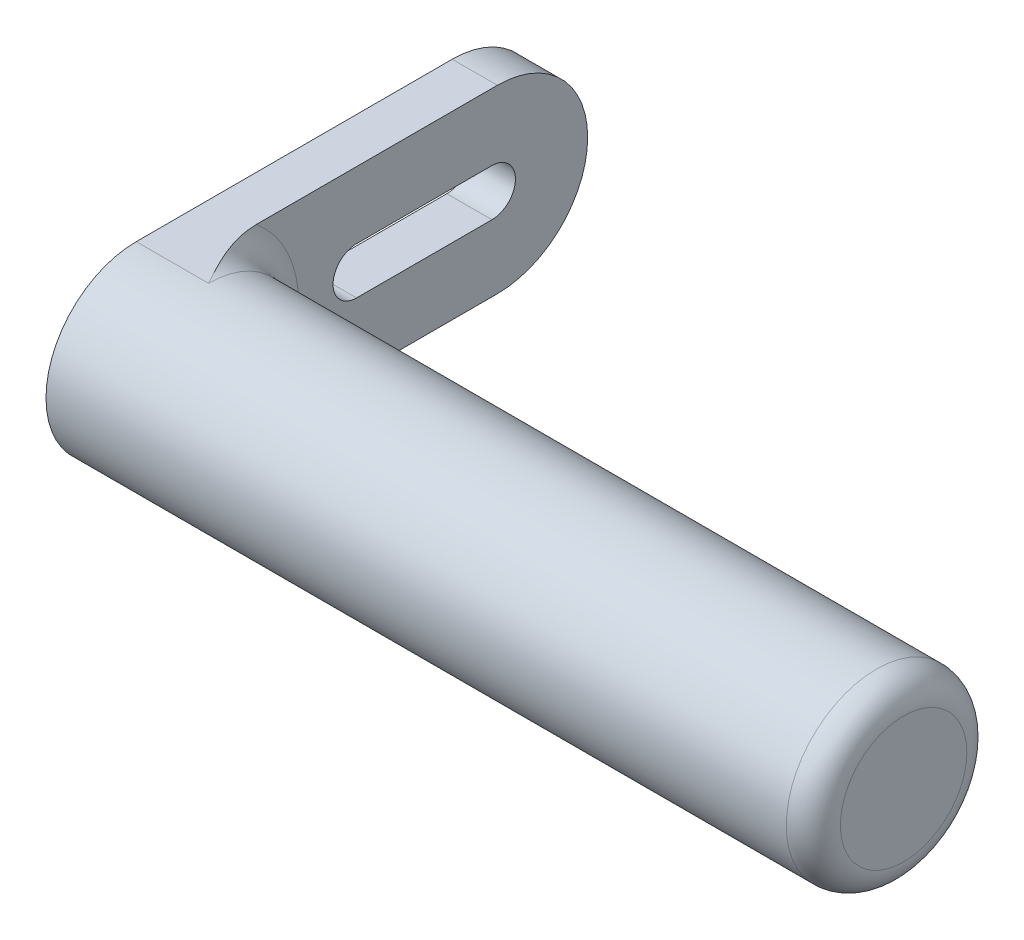
ISO-10303-21;
HEADER;
FILE_DESCRIPTION(('STEP AP214'),'2;1');
FILE_NAME('part.step','',(''),(''),'','','');
FILE_SCHEMA(('AUTOMOTIVE_DESIGN { 1 0 10303 214 1 1 1 1 }'));
ENDSEC;
DATA;
#1=APPLICATION_CONTEXT('core data for automotive mechanical design processes');
#2=APPLICATION_PROTOCOL_DEFINITION('international standard','automotive_design',2000,#1);
#3=PRODUCT_CONTEXT('',#1,'mechanical');
#4=PRODUCT('Part','Part','',(#3));
#5=PRODUCT_RELATED_PRODUCT_CATEGORY('part','',(#4));
#6=PRODUCT_DEFINITION_FORMATION('','',#4);
#7=PRODUCT_DEFINITION_CONTEXT('part definition',#1,'design');
#8=PRODUCT_DEFINITION('design','',#6,#7);
#9=PRODUCT_DEFINITION_SHAPE('','',#8);
#10=(LENGTH_UNIT() NAMED_UNIT(*) SI_UNIT(.MILLI.,.METRE.));
#11=(NAMED_UNIT(*) PLANE_ANGLE_UNIT() SI_UNIT($,.RADIAN.));
#12=(NAMED_UNIT(*) SI_UNIT($,.STERADIAN.) SOLID_ANGLE_UNIT());
#13=UNCERTAINTY_MEASURE_WITH_UNIT(LENGTH_MEASURE(1.E-05),#10,'distance_accuracy_value','');
#14=(GEOMETRIC_REPRESENTATION_CONTEXT(3) GLOBAL_UNCERTAINTY_ASSIGNED_CONTEXT((#13)) GLOBAL_UNIT_ASSIGNED_CONTEXT((#10,
#11,#12)) REPRESENTATION_CONTEXT('',''));
#15=CARTESIAN_POINT('',(0.,0.,0.));
#16=DIRECTION('',(0.,0.,1.));
#17=DIRECTION('',(1.,0.,0.));
#18=AXIS2_PLACEMENT_3D('',#15,#16,#17);
#19=CARTESIAN_POINT('',(5.,-10.,-27.5));
#20=DIRECTION('',(0.,1.,0.));
#21=DIRECTION('',(0.,0.,1.));
#22=AXIS2_PLACEMENT_3D('',#19,#20,#21);
#23=PLANE('',#22);
#24=DIRECTION('',(0.,0.,-1.));
#25=VECTOR('',#24,1.);
#26=CARTESIAN_POINT('',(0.,-10.,-27.5));
#27=LINE('',#26,#25);
#28=CARTESIAN_POINT('',(0.,-10.,17.5));
#29=VERTEX_POINT('',#28);
#30=CARTESIAN_POINT('',(0.,-10.,-17.5));
#31=VERTEX_POINT('',#30);
#32=EDGE_CURVE('E166',#29,#31,#27,.T.);
#33=ORIENTED_EDGE('',*,*,#32,.T.);
#34=DIRECTION('',(-1.,0.,0.));
#35=VECTOR('',#34,1.);
#36=CARTESIAN_POINT('',(5.,-10.,-17.5));
#37=LINE('',#36,#35);
#38=CARTESIAN_POINT('',(5.,-10.,-17.5));
#39=VERTEX_POINT('',#38);
#40=EDGE_CURVE('E182',#31,#39,#37,.F.);
#41=ORIENTED_EDGE('',*,*,#40,.T.);
#42=DIRECTION('',(0.,0.,-1.));
#43=VECTOR('',#42,1.);
#44=CARTESIAN_POINT('',(5.,-10.,-27.5));
#45=LINE('',#44,#43);
#46=CARTESIAN_POINT('',(5.,-10.,9.19337613708191));
#47=VERTEX_POINT('',#46);
#48=EDGE_CURVE('E160',#47,#39,#45,.T.);
#49=ORIENTED_EDGE('',*,*,#48,.F.);
#50=CARTESIAN_POINT('',(5.,-10.,9.19337613708191));
#51=CARTESIAN_POINT('',(5.00000510109143,-10.,9.31468516190168));
#52=CARTESIAN_POINT('',(5.00300345678224,-10.,9.43596185238606));
#53=CARTESIAN_POINT('',(5.01455369503832,-10.,9.67820887001465));
#54=CARTESIAN_POINT('',(5.02310352854649,-10.,9.79917929367025));
#55=CARTESIAN_POINT('',(5.05638491302613,-10.,10.1608609564875));
#56=CARTESIAN_POINT('',(5.08875229772567,-10.,10.4008889053362));
#57=CARTESIAN_POINT('',(5.17025826652768,-10.,10.8746661518443));
#58=CARTESIAN_POINT('',(5.21916642341927,-10.,11.1084564850378));
#59=CARTESIAN_POINT('',(5.3313246535228,-10.,11.5726822175656));
#60=CARTESIAN_POINT('',(5.39458332424151,-10.,11.8031155172388));
#61=CARTESIAN_POINT('',(5.53638839561794,-10.,12.2708661108335));
#62=CARTESIAN_POINT('',(5.61550693926716,-10.,12.5080082663547));
#63=CARTESIAN_POINT('',(5.78473378693082,-10.,12.9783635528256));
#64=CARTESIAN_POINT('',(5.87484471194332,-10.,13.2115757315748));
#65=CARTESIAN_POINT('',(6.15872613427247,-10.,13.9059414934295));
#66=CARTESIAN_POINT('',(6.36596341359942,-10.,14.3615693550655));
#67=CARTESIAN_POINT('',(6.8038510541255,-10.,15.2643439869068));
#68=CARTESIAN_POINT('',(7.0346299439147,-10.,15.7114264331831));
#69=CARTESIAN_POINT('',(7.50704928301317,-10.,16.5998419692275));
#70=CARTESIAN_POINT('',(7.74869175724695,-10.,17.041173967198));
#71=CARTESIAN_POINT('',(7.99359487601124,-10.,17.4883058946273));
#72=CARTESIAN_POINT('',(7.99679743913195,-10.,17.4941529481126));
#73=CARTESIAN_POINT('',(8.,-10.,17.5));
#74=B_SPLINE_CURVE_WITH_KNOTS('',3,(#50,#51,#52,#53,#54,#55,#56,#57,#58,#59,#60,#61,#62,#63,#64,
#65,#66,#67,#68,#69,#70,#71,#72,#73),.UNSPECIFIED.,.F.,.F.,(4,2,2,2,2,2,2,2,2,2,2,4),(0.,
0.363837513676666,0.72754081077388,1.45331414152031,2.16936699582229,2.88584998135366,
3.63550066459568,4.3853304434829,5.88579076071039,7.39493262321677,8.90435695897777,
8.92435695897769),.UNSPECIFIED.);
#75=CARTESIAN_POINT('',(8.,-10.,17.5));
#76=VERTEX_POINT('',#75);
#77=EDGE_CURVE('E207',#47,#76,#74,.T.);
#78=ORIENTED_EDGE('',*,*,#77,.T.);
#79=DIRECTION('',(-1.,0.,0.));
#80=VECTOR('',#79,1.);
#81=CARTESIAN_POINT('',(5.,-10.,17.5));
#82=LINE('',#81,#80);
#83=EDGE_CURVE('E179',#76,#29,#82,.T.);
#84=ORIENTED_EDGE('',*,*,#83,.T.);
#85=EDGE_LOOP('',(#33,#41,#49,#78,#84));
#86=FACE_BOUND('',#85,.T.);
#87=ADVANCED_FACE('F32',(#86),#23,.F.);
#88=CARTESIAN_POINT('',(5.,10.,-27.5));
#89=DIRECTION('',(0.,-1.,0.));
#90=DIRECTION('',(0.,0.,-1.));
#91=AXIS2_PLACEMENT_3D('',#88,#89,#90);
#92=PLANE('',#91);
#93=DIRECTION('',(0.,0.,1.));
#94=VECTOR('',#93,1.);
#95=CARTESIAN_POINT('',(5.,10.,-27.5));
#96=LINE('',#95,#94);
#97=CARTESIAN_POINT('',(5.,10.,-17.5));
#98=VERTEX_POINT('',#97);
#99=CARTESIAN_POINT('',(5.,10.,9.19337613708191));
#100=VERTEX_POINT('',#99);
#101=EDGE_CURVE('E162',#98,#100,#96,.T.);
#102=ORIENTED_EDGE('',*,*,#101,.F.);
#103=DIRECTION('',(-1.,0.,0.));
#104=VECTOR('',#103,1.);
#105=CARTESIAN_POINT('',(5.,10.,-17.5));
#106=LINE('',#105,#104);
#107=CARTESIAN_POINT('',(0.,10.,-17.5));
#108=VERTEX_POINT('',#107);
#109=EDGE_CURVE('E191',#98,#108,#106,.T.);
#110=ORIENTED_EDGE('',*,*,#109,.T.);
#111=DIRECTION('',(0.,0.,1.));
#112=VECTOR('',#111,1.);
#113=CARTESIAN_POINT('',(0.,10.,-27.5));
#114=LINE('',#113,#112);
#115=CARTESIAN_POINT('',(0.,10.,17.5));
#116=VERTEX_POINT('',#115);
#117=EDGE_CURVE('E163',#108,#116,#114,.T.);
#118=ORIENTED_EDGE('',*,*,#117,.T.);
#119=DIRECTION('',(-1.,0.,0.));
#120=VECTOR('',#119,1.);
#121=CARTESIAN_POINT('',(5.,10.,17.5));
#122=LINE('',#121,#120);
#123=CARTESIAN_POINT('',(8.,10.,17.5));
#124=VERTEX_POINT('',#123);
#125=EDGE_CURVE('E189',#116,#124,#122,.F.);
#126=ORIENTED_EDGE('',*,*,#125,.T.);
#127=CARTESIAN_POINT('',(5.,10.,9.19337613708191));
#128=CARTESIAN_POINT('',(5.00000510109143,10.,9.3146851619019));
#129=CARTESIAN_POINT('',(5.00300345678225,10.,9.43596185238649));
#130=CARTESIAN_POINT('',(5.01455369503837,10.,9.6782088700155));
#131=CARTESIAN_POINT('',(5.02310352854657,10.,9.79917929367132));
#132=CARTESIAN_POINT('',(5.05638491302631,10.,10.1608609564891));
#133=CARTESIAN_POINT('',(5.08875229772595,10.,10.4008889053381));
#134=CARTESIAN_POINT('',(5.17025826652805,10.,10.8746661518461));
#135=CARTESIAN_POINT('',(5.21916642341959,10.,11.1084564850392));
#136=CARTESIAN_POINT('',(5.33132465352298,10.,11.5726822175662));
#137=CARTESIAN_POINT('',(5.39458332424161,10.,11.8031155172391));
#138=CARTESIAN_POINT('',(5.53638839561793,10.,12.2708661108334));
#139=CARTESIAN_POINT('',(5.61550693926714,10.,12.5080082663546));
#140=CARTESIAN_POINT('',(5.78473378693072,10.,12.9783635528254));
#141=CARTESIAN_POINT('',(5.87484471194315,10.,13.2115757315746));
#142=CARTESIAN_POINT('',(6.15872613427236,10.,13.9059414934289));
#143=CARTESIAN_POINT('',(6.36596341359978,10.,14.3615693550642));
#144=CARTESIAN_POINT('',(6.80385105412424,10.,15.2643439869062));
#145=CARTESIAN_POINT('',(7.03462994391135,10.,15.7114264331839));
#146=CARTESIAN_POINT('',(7.50704928301584,10.,16.5998419692255));
#147=CARTESIAN_POINT('',(7.74869175725775,10.,17.0411739671918));
#148=CARTESIAN_POINT('',(7.99359487601154,10.,17.4883058946272));
#149=CARTESIAN_POINT('',(7.9967974391321,10.,17.4941529481126));
#150=CARTESIAN_POINT('',(8.,10.,17.5));
#151=B_SPLINE_CURVE_WITH_KNOTS('',3,(#127,#128,#129,#130,#131,#132,#133,#134,#135,#136,#137,
#138,#139,#140,#141,#142,#143,#144,#145,#146,#147,#148,#149,#150),.UNSPECIFIED.,.F.,.F.,(4,2,2,
2,2,2,2,2,2,2,2,4),(0.,0.363837513677303,0.727540810775156,1.45331414152258,2.16936699582333,
2.88584998135365,3.63550066459548,4.38533044348258,5.88579076070911,7.39493262321602,
8.9043569589778,8.92435695897769),.UNSPECIFIED.);
#152=EDGE_CURVE('E47',#124,#100,#151,.F.);
#153=ORIENTED_EDGE('',*,*,#152,.T.);
#154=EDGE_LOOP('',(#102,#110,#118,#126,#153));
#155=FACE_BOUND('',#154,.T.);
#156=ADVANCED_FACE('F216',(#155),#92,.F.);
#157=CARTESIAN_POINT('',(5.,0.,0.));
#158=DIRECTION('',(1.,0.,0.));
#159=DIRECTION('',(0.,0.,-1.));
#160=AXIS2_PLACEMENT_3D('',#157,#158,#159);
#161=PLANE('',#160);
#162=ORIENTED_EDGE('',*,*,#101,.T.);
#163=CARTESIAN_POINT('',(5.,0.,17.5));
#164=DIRECTION('',(1.,0.,0.));
#165=DIRECTION('',(0.,0.,-1.));
#166=AXIS2_PLACEMENT_3D('',#163,#164,#165);
#167=CIRCLE('',#166,13.);
#168=EDGE_CURVE('E54',#100,#47,#167,.F.);
#169=ORIENTED_EDGE('',*,*,#168,.T.);
#170=ORIENTED_EDGE('',*,*,#48,.T.);
#171=CARTESIAN_POINT('',(5.,0.,-17.5));
#172=DIRECTION('',(1.,0.,0.));
#173=DIRECTION('',(0.,0.,-1.));
#174=AXIS2_PLACEMENT_3D('',#171,#172,#173);
#175=CIRCLE('',#174,10.);
#176=CARTESIAN_POINT('',(5.,0.,-27.5));
#177=VERTEX_POINT('',#176);
#178=EDGE_CURVE('E187',#39,#177,#175,.T.);
#179=ORIENTED_EDGE('',*,*,#178,.T.);
#180=CARTESIAN_POINT('',(5.,0.,-17.5));
#181=DIRECTION('',(1.,0.,0.));
#182=DIRECTION('',(0.,0.,-1.));
#183=AXIS2_PLACEMENT_3D('',#180,#181,#182);
#184=CIRCLE('',#183,10.);
#185=EDGE_CURVE('E185',#177,#98,#184,.T.);
#186=ORIENTED_EDGE('',*,*,#185,.T.);
#187=EDGE_LOOP('',(#162,#169,#170,#179,#186));
#188=FACE_BOUND('',#187,.T.);
#189=CARTESIAN_POINT('',(5.,0.,-16.9));
#190=DIRECTION('',(1.,0.,0.));
#191=DIRECTION('',(0.,0.,1.));
#192=AXIS2_PLACEMENT_3D('',#189,#190,#191);
#193=CIRCLE('',#192,2.60000000000001);
#194=CARTESIAN_POINT('',(5.,-2.60000000000001,-16.9));
#195=VERTEX_POINT('',#194);
#196=CARTESIAN_POINT('',(5.,2.60000000000001,-16.9));
#197=VERTEX_POINT('',#196);
#198=EDGE_CURVE('E123',#195,#197,#193,.T.);
#199=ORIENTED_EDGE('',*,*,#198,.F.);
#200=DIRECTION('',(0.,0.,-1.));
#201=VECTOR('',#200,1.);
#202=CARTESIAN_POINT('',(5.,-2.60000000000001,-16.9));
#203=LINE('',#202,#201);
#204=CARTESIAN_POINT('',(5.,-2.6,-1.90000000000001));
#205=VERTEX_POINT('',#204);
#206=EDGE_CURVE('E141',#205,#195,#203,.T.);
#207=ORIENTED_EDGE('',*,*,#206,.F.);
#208=CARTESIAN_POINT('',(5.,0.,-1.90000000000001));
#209=DIRECTION('',(1.,0.,0.));
#210=DIRECTION('',(0.,0.,-1.));
#211=AXIS2_PLACEMENT_3D('',#208,#209,#210);
#212=CIRCLE('',#211,2.6);
#213=CARTESIAN_POINT('',(5.,2.6,-1.90000000000001));
#214=VERTEX_POINT('',#213);
#215=EDGE_CURVE('E144',#214,#205,#212,.T.);
#216=ORIENTED_EDGE('',*,*,#215,.F.);
#217=DIRECTION('',(0.,0.,1.));
#218=VECTOR('',#217,1.);
#219=CARTESIAN_POINT('',(5.,2.60000000000001,-16.9));
#220=LINE('',#219,#218);
#221=EDGE_CURVE('E150',#197,#214,#220,.T.);
#222=ORIENTED_EDGE('',*,*,#221,.F.);
#223=EDGE_LOOP('',(#199,#207,#216,#222));
#224=FACE_BOUND('',#223,.T.);
#225=ADVANCED_FACE('F220',(#188,#224),#161,.T.);
#226=CARTESIAN_POINT('',(0.,0.,0.));
#227=DIRECTION('',(1.,0.,0.));
#228=DIRECTION('',(0.,0.,-1.));
#229=AXIS2_PLACEMENT_3D('',#226,#227,#228);
#230=PLANE('',#229);
#231=DIRECTION('',(0.,0.,-1.));
#232=VECTOR('',#231,1.);
#233=CARTESIAN_POINT('',(0.,-2.60000000000001,-16.9));
#234=LINE('',#233,#232);
#235=CARTESIAN_POINT('',(0.,-2.6,-1.90000000000001));
#236=VERTEX_POINT('',#235);
#237=CARTESIAN_POINT('',(0.,-2.60000000000001,-16.9));
#238=VERTEX_POINT('',#237);
#239=EDGE_CURVE('E128',#236,#238,#234,.T.);
#240=ORIENTED_EDGE('',*,*,#239,.T.);
#241=CARTESIAN_POINT('',(0.,0.,-16.9));
#242=DIRECTION('',(1.,0.,0.));
#243=DIRECTION('',(0.,0.,1.));
#244=AXIS2_PLACEMENT_3D('',#241,#242,#243);
#245=CIRCLE('',#244,2.60000000000001);
#246=CARTESIAN_POINT('',(0.,2.60000000000001,-16.9));
#247=VERTEX_POINT('',#246);
#248=EDGE_CURVE('E120',#238,#247,#245,.T.);
#249=ORIENTED_EDGE('',*,*,#248,.T.);
#250=DIRECTION('',(0.,0.,1.));
#251=VECTOR('',#250,1.);
#252=CARTESIAN_POINT('',(0.,2.60000000000001,-16.9));
#253=LINE('',#252,#251);
#254=CARTESIAN_POINT('',(0.,2.6,-1.90000000000001));
#255=VERTEX_POINT('',#254);
#256=EDGE_CURVE('E132',#247,#255,#253,.T.);
#257=ORIENTED_EDGE('',*,*,#256,.T.);
#258=CARTESIAN_POINT('',(0.,0.,-1.90000000000001));
#259=DIRECTION('',(1.,0.,0.));
#260=DIRECTION('',(0.,0.,-1.));
#261=AXIS2_PLACEMENT_3D('',#258,#259,#260);
#262=CIRCLE('',#261,2.6);
#263=EDGE_CURVE('E136',#255,#236,#262,.T.);
#264=ORIENTED_EDGE('',*,*,#263,.T.);
#265=EDGE_LOOP('',(#240,#249,#257,#264));
#266=FACE_BOUND('',#265,.T.);
#267=CARTESIAN_POINT('',(0.,0.,-17.5));
#268=DIRECTION('',(1.,0.,0.));
#269=DIRECTION('',(0.,0.,-1.));
#270=AXIS2_PLACEMENT_3D('',#267,#268,#269);
#271=CIRCLE('',#270,10.);
#272=CARTESIAN_POINT('',(0.,0.,-27.5));
#273=VERTEX_POINT('',#272);
#274=EDGE_CURVE('E175',#108,#273,#271,.F.);
#275=ORIENTED_EDGE('',*,*,#274,.T.);
#276=CARTESIAN_POINT('',(0.,0.,-17.5));
#277=DIRECTION('',(1.,0.,0.));
#278=DIRECTION('',(0.,0.,-1.));
#279=AXIS2_PLACEMENT_3D('',#276,#277,#278);
#280=CIRCLE('',#279,10.);
#281=EDGE_CURVE('E177',#273,#31,#280,.F.);
#282=ORIENTED_EDGE('',*,*,#281,.T.);
#283=ORIENTED_EDGE('',*,*,#32,.F.);
#284=CARTESIAN_POINT('',(0.,0.,17.5));
#285=DIRECTION('',(1.,0.,0.));
#286=DIRECTION('',(0.,0.,-1.));
#287=AXIS2_PLACEMENT_3D('',#284,#285,#286);
#288=CIRCLE('',#287,10.);
#289=CARTESIAN_POINT('',(0.,0.,27.5));
#290=VERTEX_POINT('',#289);
#291=EDGE_CURVE('E173',#29,#290,#288,.F.);
#292=ORIENTED_EDGE('',*,*,#291,.T.);
#293=CARTESIAN_POINT('',(0.,0.,17.5));
#294=DIRECTION('',(1.,0.,0.));
#295=DIRECTION('',(0.,0.,-1.));
#296=AXIS2_PLACEMENT_3D('',#293,#294,#295);
#297=CIRCLE('',#296,10.);
#298=EDGE_CURVE('E165',#290,#116,#297,.F.);
#299=ORIENTED_EDGE('',*,*,#298,.T.);
#300=ORIENTED_EDGE('',*,*,#117,.F.);
#301=EDGE_LOOP('',(#275,#282,#283,#292,#299,#300));
#302=FACE_BOUND('',#301,.T.);
#303=ADVANCED_FACE('F138',(#266,#302),#230,.F.);
#304=CARTESIAN_POINT('',(5.,0.,-17.5));
#305=DIRECTION('',(-1.,0.,0.));
#306=DIRECTION('',(0.,0.,1.));
#307=AXIS2_PLACEMENT_3D('',#304,#305,#306);
#308=CYLINDRICAL_SURFACE('',#307,10.);
#309=ORIENTED_EDGE('',*,*,#109,.F.);
#310=ORIENTED_EDGE('',*,*,#185,.F.);
#311=DIRECTION('',(-1.,0.,0.));
#312=VECTOR('',#311,1.);
#313=CARTESIAN_POINT('',(5.,0.,-27.5));
#314=LINE('',#313,#312);
#315=EDGE_CURVE('E169',#273,#177,#314,.F.);
#316=ORIENTED_EDGE('',*,*,#315,.F.);
#317=ORIENTED_EDGE('',*,*,#274,.F.);
#318=EDGE_LOOP('',(#309,#310,#316,#317));
#319=FACE_BOUND('',#318,.T.);
#320=ADVANCED_FACE('F230',(#319),#308,.T.);
#321=CARTESIAN_POINT('',(5.,0.,-17.5));
#322=DIRECTION('',(-1.,0.,0.));
#323=DIRECTION('',(0.,0.,1.));
#324=AXIS2_PLACEMENT_3D('',#321,#322,#323);
#325=CYLINDRICAL_SURFACE('',#324,10.);
#326=ORIENTED_EDGE('',*,*,#178,.F.);
#327=ORIENTED_EDGE('',*,*,#40,.F.);
#328=ORIENTED_EDGE('',*,*,#281,.F.);
#329=ORIENTED_EDGE('',*,*,#315,.T.);
#330=EDGE_LOOP('',(#326,#327,#328,#329));
#331=FACE_BOUND('',#330,.T.);
#332=ADVANCED_FACE('F226',(#331),#325,.T.);
#333=CARTESIAN_POINT('',(5.,0.,17.5));
#334=DIRECTION('',(-1.,0.,0.));
#335=DIRECTION('',(0.,0.,1.));
#336=AXIS2_PLACEMENT_3D('',#333,#334,#335);
#337=CYLINDRICAL_SURFACE('',#336,10.);
#338=CARTESIAN_POINT('',(82.,0.,17.5));
#339=DIRECTION('',(1.,0.,0.));
#340=DIRECTION('',(0.,0.,-1.));
#341=AXIS2_PLACEMENT_3D('',#338,#339,#340);
#342=CIRCLE('',#341,10.);
#343=CARTESIAN_POINT('',(82.,0.,7.49999999999999));
#344=VERTEX_POINT('',#343);
#345=EDGE_CURVE('E11',#344,#344,#342,.F.);
#346=ORIENTED_EDGE('',*,*,#345,.T.);
#347=EDGE_LOOP('',(#346));
#348=FACE_BOUND('',#347,.T.);
#349=CARTESIAN_POINT('',(8.,0.,17.5));
#350=DIRECTION('',(1.,0.,0.));
#351=DIRECTION('',(0.,0.,-1.));
#352=AXIS2_PLACEMENT_3D('',#349,#350,#351);
#353=CIRCLE('',#352,10.);
#354=EDGE_CURVE('E193',#76,#124,#353,.T.);
#355=ORIENTED_EDGE('',*,*,#354,.T.);
#356=ORIENTED_EDGE('',*,*,#125,.F.);
#357=ORIENTED_EDGE('',*,*,#298,.F.);
#358=DIRECTION('',(-1.,0.,0.));
#359=VECTOR('',#358,1.);
#360=CARTESIAN_POINT('',(5.,0.,27.5));
#361=LINE('',#360,#359);
#362=CARTESIAN_POINT('',(5.,0.,27.5));
#363=VERTEX_POINT('',#362);
#364=EDGE_CURVE('E156',#363,#290,#361,.T.);
#365=ORIENTED_EDGE('',*,*,#364,.F.);
#366=ORIENTED_EDGE('',*,*,#364,.T.);
#367=ORIENTED_EDGE('',*,*,#291,.F.);
#368=ORIENTED_EDGE('',*,*,#83,.F.);
#369=EDGE_LOOP('',(#355,#356,#357,#365,#366,#367,#368));
#370=FACE_BOUND('',#369,.T.);
#371=ADVANCED_FACE('F229',(#348,#370),#337,.T.);
#372=CARTESIAN_POINT('',(0.,0.,-16.9));
#373=DIRECTION('',(1.,0.,0.));
#374=DIRECTION('',(0.,0.,-1.));
#375=AXIS2_PLACEMENT_3D('',#372,#373,#374);
#376=CYLINDRICAL_SURFACE('',#375,2.60000000000001);
#377=ORIENTED_EDGE('',*,*,#198,.T.);
#378=DIRECTION('',(1.,0.,0.));
#379=VECTOR('',#378,1.);
#380=CARTESIAN_POINT('',(0.,2.60000000000001,-16.9));
#381=LINE('',#380,#379);
#382=EDGE_CURVE('E116',#247,#197,#381,.T.);
#383=ORIENTED_EDGE('',*,*,#382,.F.);
#384=ORIENTED_EDGE('',*,*,#248,.F.);
#385=DIRECTION('',(1.,0.,0.));
#386=VECTOR('',#385,1.);
#387=CARTESIAN_POINT('',(0.,-2.60000000000001,-16.9));
#388=LINE('',#387,#386);
#389=EDGE_CURVE('E154',#238,#195,#388,.T.);
#390=ORIENTED_EDGE('',*,*,#389,.T.);
#391=EDGE_LOOP('',(#377,#383,#384,#390));
#392=FACE_BOUND('',#391,.T.);
#393=ADVANCED_FACE('F118',(#392),#376,.F.);
#394=CARTESIAN_POINT('',(0.,-2.60000000000001,-16.9));
#395=DIRECTION('',(0.,-1.,0.));
#396=DIRECTION('',(0.,0.,-1.));
#397=AXIS2_PLACEMENT_3D('',#394,#395,#396);
#398=PLANE('',#397);
#399=ORIENTED_EDGE('',*,*,#206,.T.);
#400=ORIENTED_EDGE('',*,*,#389,.F.);
#401=ORIENTED_EDGE('',*,*,#239,.F.);
#402=DIRECTION('',(1.,0.,0.));
#403=VECTOR('',#402,1.);
#404=CARTESIAN_POINT('',(0.,-2.6,-1.90000000000001));
#405=LINE('',#404,#403);
#406=EDGE_CURVE('E157',#236,#205,#405,.T.);
#407=ORIENTED_EDGE('',*,*,#406,.T.);
#408=EDGE_LOOP('',(#399,#400,#401,#407));
#409=FACE_BOUND('',#408,.T.);
#410=ADVANCED_FACE('F239',(#409),#398,.F.);
#411=CARTESIAN_POINT('',(0.,0.,-1.90000000000001));
#412=DIRECTION('',(1.,0.,0.));
#413=DIRECTION('',(0.,0.,-1.));
#414=AXIS2_PLACEMENT_3D('',#411,#412,#413);
#415=CYLINDRICAL_SURFACE('',#414,2.6);
#416=ORIENTED_EDGE('',*,*,#215,.T.);
#417=ORIENTED_EDGE('',*,*,#406,.F.);
#418=ORIENTED_EDGE('',*,*,#263,.F.);
#419=DIRECTION('',(1.,0.,0.));
#420=VECTOR('',#419,1.);
#421=CARTESIAN_POINT('',(0.,2.6,-1.90000000000001));
#422=LINE('',#421,#420);
#423=EDGE_CURVE('E127',#255,#214,#422,.T.);
#424=ORIENTED_EDGE('',*,*,#423,.T.);
#425=EDGE_LOOP('',(#416,#417,#418,#424));
#426=FACE_BOUND('',#425,.T.);
#427=ADVANCED_FACE('F266',(#426),#415,.F.);
#428=CARTESIAN_POINT('',(0.,2.60000000000001,-16.9));
#429=DIRECTION('',(0.,1.,0.));
#430=DIRECTION('',(0.,0.,1.));
#431=AXIS2_PLACEMENT_3D('',#428,#429,#430);
#432=PLANE('',#431);
#433=ORIENTED_EDGE('',*,*,#221,.T.);
#434=ORIENTED_EDGE('',*,*,#423,.F.);
#435=ORIENTED_EDGE('',*,*,#256,.F.);
#436=ORIENTED_EDGE('',*,*,#382,.T.);
#437=EDGE_LOOP('',(#433,#434,#435,#436));
#438=FACE_BOUND('',#437,.T.);
#439=ADVANCED_FACE('F133',(#438),#432,.F.);
#440=CARTESIAN_POINT('',(85.,0.,17.5));
#441=DIRECTION('',(1.,0.,0.));
#442=DIRECTION('',(0.,0.,-1.));
#443=AXIS2_PLACEMENT_3D('',#440,#441,#442);
#444=PLANE('',#443);
#445=CARTESIAN_POINT('',(85.,0.,17.5));
#446=DIRECTION('',(1.,0.,0.));
#447=DIRECTION('',(0.,0.,-1.));
#448=AXIS2_PLACEMENT_3D('',#445,#446,#447);
#449=CIRCLE('',#448,7.);
#450=CARTESIAN_POINT('',(85.,0.,10.5));
#451=VERTEX_POINT('',#450);
#452=EDGE_CURVE('E40',#451,#451,#449,.T.);
#453=ORIENTED_EDGE('',*,*,#452,.T.);
#454=EDGE_LOOP('',(#453));
#455=FACE_BOUND('',#454,.T.);
#456=ADVANCED_FACE('F252',(#455),#444,.T.);
#457=CARTESIAN_POINT('',(8.,0.,17.5));
#458=DIRECTION('',(1.,0.,0.));
#459=DIRECTION('',(0.,0.,-1.));
#460=AXIS2_PLACEMENT_3D('',#457,#458,#459);
#461=TOROIDAL_SURFACE('',#460,13.,3.);
#462=ORIENTED_EDGE('',*,*,#77,.F.);
#463=ORIENTED_EDGE('',*,*,#168,.F.);
#464=ORIENTED_EDGE('',*,*,#152,.F.);
#465=ORIENTED_EDGE('',*,*,#354,.F.);
#466=EDGE_LOOP('',(#462,#463,#464,#465));
#467=FACE_BOUND('',#466,.T.);
#468=ADVANCED_FACE('F213',(#467),#461,.F.);
#469=CARTESIAN_POINT('',(82.,0.,17.5));
#470=DIRECTION('',(1.,0.,0.));
#471=DIRECTION('',(0.,0.,-1.));
#472=AXIS2_PLACEMENT_3D('',#469,#470,#471);
#473=TOROIDAL_SURFACE('',#472,7.,3.);
#474=ORIENTED_EDGE('',*,*,#345,.F.);
#475=EDGE_LOOP('',(#474));
#476=FACE_BOUND('',#475,.T.);
#477=ORIENTED_EDGE('',*,*,#452,.F.);
#478=EDGE_LOOP('',(#477));
#479=FACE_BOUND('',#478,.T.);
#480=ADVANCED_FACE('F34',(#476,#479),#473,.T.);
#481=CLOSED_SHELL('',(#87,#156,#225,#303,#320,#332,#371,#393,#410,#427,#439,#456,#468,#480));
#482=MANIFOLD_SOLID_BREP('B2',#481);
#483=ADVANCED_BREP_SHAPE_REPRESENTATION('',(#18,#482),#14);
#484=SHAPE_DEFINITION_REPRESENTATION(#9,#483);
ENDSEC;
END-ISO-10303-21;
